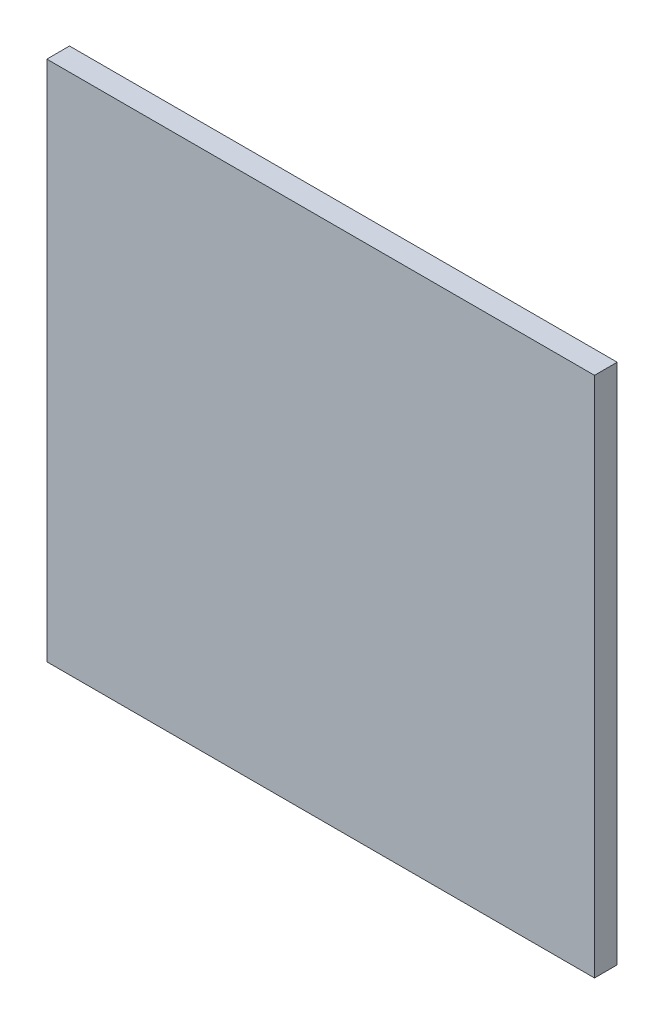
ISO-10303-21;
HEADER;
FILE_DESCRIPTION(('STEP AP214'),'2;1');
FILE_NAME('part.step','',(''),(''),'','','');
FILE_SCHEMA(('AUTOMOTIVE_DESIGN { 1 0 10303 214 1 1 1 1 }'));
ENDSEC;
DATA;
#1=APPLICATION_CONTEXT('core data for automotive mechanical design processes');
#2=APPLICATION_PROTOCOL_DEFINITION('international standard','automotive_design',2000,#1);
#3=PRODUCT_CONTEXT('',#1,'mechanical');
#4=PRODUCT('Part','Part','',(#3));
#5=PRODUCT_RELATED_PRODUCT_CATEGORY('part','',(#4));
#6=PRODUCT_DEFINITION_FORMATION('','',#4);
#7=PRODUCT_DEFINITION_CONTEXT('part definition',#1,'design');
#8=PRODUCT_DEFINITION('design','',#6,#7);
#9=PRODUCT_DEFINITION_SHAPE('','',#8);
#10=(LENGTH_UNIT() NAMED_UNIT(*) SI_UNIT(.MILLI.,.METRE.));
#11=(NAMED_UNIT(*) PLANE_ANGLE_UNIT() SI_UNIT($,.RADIAN.));
#12=(NAMED_UNIT(*) SI_UNIT($,.STERADIAN.) SOLID_ANGLE_UNIT());
#13=UNCERTAINTY_MEASURE_WITH_UNIT(LENGTH_MEASURE(1.E-05),#10,'distance_accuracy_value','');
#14=(GEOMETRIC_REPRESENTATION_CONTEXT(3) GLOBAL_UNCERTAINTY_ASSIGNED_CONTEXT((#13)) GLOBAL_UNIT_ASSIGNED_CONTEXT((#10,
#11,#12)) REPRESENTATION_CONTEXT('',''));
#15=CARTESIAN_POINT('',(0.,0.,0.));
#16=DIRECTION('',(0.,0.,1.));
#17=DIRECTION('',(1.,0.,0.));
#18=AXIS2_PLACEMENT_3D('',#15,#16,#17);
#19=CARTESIAN_POINT('',(18.1,17.25,1.5));
#20=DIRECTION('',(-1.,0.,0.));
#21=DIRECTION('',(0.,-1.,0.));
#22=AXIS2_PLACEMENT_3D('',#19,#20,#21);
#23=PLANE('',#22);
#24=DIRECTION('',(0.,1.,0.));
#25=VECTOR('',#24,1.);
#26=CARTESIAN_POINT('',(18.1,17.25,0.));
#27=LINE('',#26,#25);
#28=CARTESIAN_POINT('',(18.1,-17.25,0.));
#29=VERTEX_POINT('',#28);
#30=CARTESIAN_POINT('',(18.1,17.25,0.));
#31=VERTEX_POINT('',#30);
#32=EDGE_CURVE('E94',#29,#31,#27,.T.);
#33=ORIENTED_EDGE('',*,*,#32,.T.);
#34=DIRECTION('',(0.,0.,-1.));
#35=VECTOR('',#34,1.);
#36=CARTESIAN_POINT('',(18.1,17.25,1.5));
#37=LINE('',#36,#35);
#38=CARTESIAN_POINT('',(18.1,17.25,1.5));
#39=VERTEX_POINT('',#38);
#40=EDGE_CURVE('E11',#39,#31,#37,.T.);
#41=ORIENTED_EDGE('',*,*,#40,.F.);
#42=DIRECTION('',(0.,1.,0.));
#43=VECTOR('',#42,1.);
#44=CARTESIAN_POINT('',(18.1,17.25,1.5));
#45=LINE('',#44,#43);
#46=CARTESIAN_POINT('',(18.1,-17.25,1.5));
#47=VERTEX_POINT('',#46);
#48=EDGE_CURVE('E82',#47,#39,#45,.T.);
#49=ORIENTED_EDGE('',*,*,#48,.F.);
#50=DIRECTION('',(0.,0.,-1.));
#51=VECTOR('',#50,1.);
#52=CARTESIAN_POINT('',(18.1,-17.25,1.5));
#53=LINE('',#52,#51);
#54=EDGE_CURVE('E90',#47,#29,#53,.T.);
#55=ORIENTED_EDGE('',*,*,#54,.T.);
#56=EDGE_LOOP('',(#33,#41,#49,#55));
#57=FACE_BOUND('',#56,.T.);
#58=ADVANCED_FACE('F31',(#57),#23,.F.);
#59=CARTESIAN_POINT('',(-18.1,17.25,1.5));
#60=DIRECTION('',(0.,-1.,0.));
#61=DIRECTION('',(0.,0.,-1.));
#62=AXIS2_PLACEMENT_3D('',#59,#60,#61);
#63=PLANE('',#62);
#64=DIRECTION('',(-1.,0.,0.));
#65=VECTOR('',#64,1.);
#66=CARTESIAN_POINT('',(-18.1,17.25,0.));
#67=LINE('',#66,#65);
#68=CARTESIAN_POINT('',(-18.1,17.25,0.));
#69=VERTEX_POINT('',#68);
#70=EDGE_CURVE('E86',#31,#69,#67,.T.);
#71=ORIENTED_EDGE('',*,*,#70,.T.);
#72=DIRECTION('',(0.,0.,-1.));
#73=VECTOR('',#72,1.);
#74=CARTESIAN_POINT('',(-18.1,17.25,1.5));
#75=LINE('',#74,#73);
#76=CARTESIAN_POINT('',(-18.1,17.25,1.5));
#77=VERTEX_POINT('',#76);
#78=EDGE_CURVE('E39',#77,#69,#75,.T.);
#79=ORIENTED_EDGE('',*,*,#78,.F.);
#80=DIRECTION('',(-1.,0.,0.));
#81=VECTOR('',#80,1.);
#82=CARTESIAN_POINT('',(-18.1,17.25,1.5));
#83=LINE('',#82,#81);
#84=EDGE_CURVE('E77',#39,#77,#83,.T.);
#85=ORIENTED_EDGE('',*,*,#84,.F.);
#86=ORIENTED_EDGE('',*,*,#40,.T.);
#87=EDGE_LOOP('',(#71,#79,#85,#86));
#88=FACE_BOUND('',#87,.T.);
#89=ADVANCED_FACE('F85',(#88),#63,.F.);
#90=CARTESIAN_POINT('',(-18.1,17.25,1.5));
#91=DIRECTION('',(1.,0.,0.));
#92=DIRECTION('',(0.,1.,0.));
#93=AXIS2_PLACEMENT_3D('',#90,#91,#92);
#94=PLANE('',#93);
#95=DIRECTION('',(0.,-1.,0.));
#96=VECTOR('',#95,1.);
#97=CARTESIAN_POINT('',(-18.1,17.25,0.));
#98=LINE('',#97,#96);
#99=CARTESIAN_POINT('',(-18.1,-17.25,0.));
#100=VERTEX_POINT('',#99);
#101=EDGE_CURVE('E64',#69,#100,#98,.T.);
#102=ORIENTED_EDGE('',*,*,#101,.T.);
#103=DIRECTION('',(0.,0.,-1.));
#104=VECTOR('',#103,1.);
#105=CARTESIAN_POINT('',(-18.1,-17.25,1.5));
#106=LINE('',#105,#104);
#107=CARTESIAN_POINT('',(-18.1,-17.25,1.5));
#108=VERTEX_POINT('',#107);
#109=EDGE_CURVE('E87',#108,#100,#106,.T.);
#110=ORIENTED_EDGE('',*,*,#109,.F.);
#111=DIRECTION('',(0.,-1.,0.));
#112=VECTOR('',#111,1.);
#113=CARTESIAN_POINT('',(-18.1,17.25,1.5));
#114=LINE('',#113,#112);
#115=EDGE_CURVE('E80',#77,#108,#114,.T.);
#116=ORIENTED_EDGE('',*,*,#115,.F.);
#117=ORIENTED_EDGE('',*,*,#78,.T.);
#118=EDGE_LOOP('',(#102,#110,#116,#117));
#119=FACE_BOUND('',#118,.T.);
#120=ADVANCED_FACE('F88',(#119),#94,.F.);
#121=CARTESIAN_POINT('',(-18.1,-17.25,1.5));
#122=DIRECTION('',(0.,1.,0.));
#123=DIRECTION('',(0.,0.,1.));
#124=AXIS2_PLACEMENT_3D('',#121,#122,#123);
#125=PLANE('',#124);
#126=DIRECTION('',(1.,0.,0.));
#127=VECTOR('',#126,1.);
#128=CARTESIAN_POINT('',(-18.1,-17.25,0.));
#129=LINE('',#128,#127);
#130=EDGE_CURVE('E70',#100,#29,#129,.T.);
#131=ORIENTED_EDGE('',*,*,#130,.T.);
#132=ORIENTED_EDGE('',*,*,#54,.F.);
#133=DIRECTION('',(1.,0.,0.));
#134=VECTOR('',#133,1.);
#135=CARTESIAN_POINT('',(-18.1,-17.25,1.5));
#136=LINE('',#135,#134);
#137=EDGE_CURVE('E47',#108,#47,#136,.T.);
#138=ORIENTED_EDGE('',*,*,#137,.F.);
#139=ORIENTED_EDGE('',*,*,#109,.T.);
#140=EDGE_LOOP('',(#131,#132,#138,#139));
#141=FACE_BOUND('',#140,.T.);
#142=ADVANCED_FACE('F101',(#141),#125,.F.);
#143=CARTESIAN_POINT('',(18.1,-17.25,1.5));
#144=DIRECTION('',(0.,0.,1.));
#145=DIRECTION('',(1.,0.,0.));
#146=AXIS2_PLACEMENT_3D('',#143,#144,#145);
#147=PLANE('',#146);
#148=ORIENTED_EDGE('',*,*,#48,.T.);
#149=ORIENTED_EDGE('',*,*,#84,.T.);
#150=ORIENTED_EDGE('',*,*,#115,.T.);
#151=ORIENTED_EDGE('',*,*,#137,.T.);
#152=EDGE_LOOP('',(#148,#149,#150,#151));
#153=FACE_BOUND('',#152,.T.);
#154=ADVANCED_FACE('F78',(#153),#147,.T.);
#155=CARTESIAN_POINT('',(18.1,-17.25,0.));
#156=DIRECTION('',(0.,0.,1.));
#157=DIRECTION('',(1.,0.,0.));
#158=AXIS2_PLACEMENT_3D('',#155,#156,#157);
#159=PLANE('',#158);
#160=ORIENTED_EDGE('',*,*,#32,.F.);
#161=ORIENTED_EDGE('',*,*,#130,.F.);
#162=ORIENTED_EDGE('',*,*,#101,.F.);
#163=ORIENTED_EDGE('',*,*,#70,.F.);
#164=EDGE_LOOP('',(#160,#161,#162,#163));
#165=FACE_BOUND('',#164,.T.);
#166=ADVANCED_FACE('F104',(#165),#159,.F.);
#167=CLOSED_SHELL('',(#58,#89,#120,#142,#154,#166));
#168=MANIFOLD_SOLID_BREP('B2',#167);
#169=ADVANCED_BREP_SHAPE_REPRESENTATION('',(#18,#168),#14);
#170=SHAPE_DEFINITION_REPRESENTATION(#9,#169);
ENDSEC;
END-ISO-10303-21;
